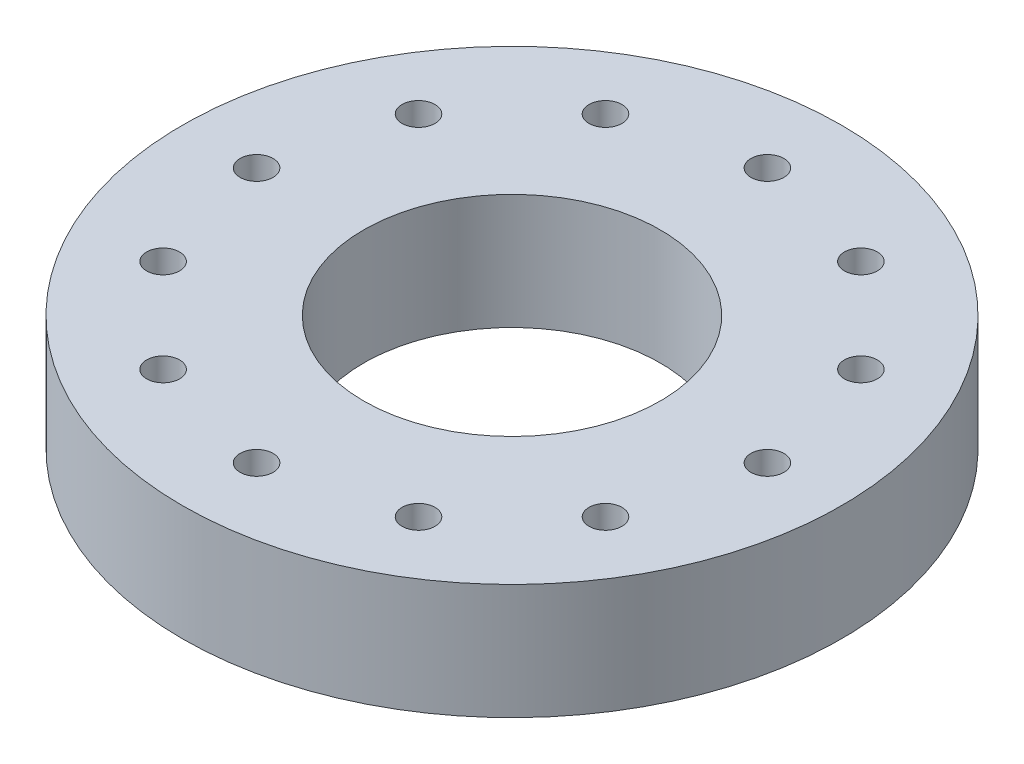
ISO-10303-21;
HEADER;
FILE_DESCRIPTION(('STEP AP214'),'2;1');
FILE_NAME('part.step','',(''),(''),'','','');
FILE_SCHEMA(('AUTOMOTIVE_DESIGN { 1 0 10303 214 1 1 1 1 }'));
ENDSEC;
DATA;
#1=APPLICATION_CONTEXT('core data for automotive mechanical design processes');
#2=APPLICATION_PROTOCOL_DEFINITION('international standard','automotive_design',2000,#1);
#3=PRODUCT_CONTEXT('',#1,'mechanical');
#4=PRODUCT('Part','Part','',(#3));
#5=PRODUCT_RELATED_PRODUCT_CATEGORY('part','',(#4));
#6=PRODUCT_DEFINITION_FORMATION('','',#4);
#7=PRODUCT_DEFINITION_CONTEXT('part definition',#1,'design');
#8=PRODUCT_DEFINITION('design','',#6,#7);
#9=PRODUCT_DEFINITION_SHAPE('','',#8);
#10=(LENGTH_UNIT() NAMED_UNIT(*) SI_UNIT(.MILLI.,.METRE.));
#11=(NAMED_UNIT(*) PLANE_ANGLE_UNIT() SI_UNIT($,.RADIAN.));
#12=(NAMED_UNIT(*) SI_UNIT($,.STERADIAN.) SOLID_ANGLE_UNIT());
#13=UNCERTAINTY_MEASURE_WITH_UNIT(LENGTH_MEASURE(1.E-05),#10,'distance_accuracy_value','');
#14=(GEOMETRIC_REPRESENTATION_CONTEXT(3) GLOBAL_UNCERTAINTY_ASSIGNED_CONTEXT((#13)) GLOBAL_UNIT_ASSIGNED_CONTEXT((#10,
#11,#12)) REPRESENTATION_CONTEXT('',''));
#15=CARTESIAN_POINT('',(0.,0.,0.));
#16=DIRECTION('',(0.,0.,1.));
#17=DIRECTION('',(1.,0.,0.));
#18=AXIS2_PLACEMENT_3D('',#15,#16,#17);
#19=CARTESIAN_POINT('',(0.,7.,0.));
#20=DIRECTION('',(0.,1.,0.));
#21=DIRECTION('',(0.,0.,1.));
#22=AXIS2_PLACEMENT_3D('',#19,#20,#21);
#23=PLANE('',#22);
#24=CARTESIAN_POINT('',(-13.4233937586585,7.,-7.74999999999942));
#25=DIRECTION('',(0.,1.,0.));
#26=DIRECTION('',(0.,0.,1.));
#27=AXIS2_PLACEMENT_3D('',#24,#25,#26);
#28=CIRCLE('',#27,1.00000000000067);
#29=CARTESIAN_POINT('',(-13.4233937586585,7.,-6.74999999999875));
#30=VERTEX_POINT('',#29);
#31=EDGE_CURVE('E107',#30,#30,#28,.T.);
#32=ORIENTED_EDGE('',*,*,#31,.F.);
#33=EDGE_LOOP('',(#32));
#34=FACE_BOUND('',#33,.T.);
#35=CARTESIAN_POINT('',(-13.4233937586578,7.,7.75000000000058));
#36=DIRECTION('',(0.,1.,0.));
#37=DIRECTION('',(0.,0.,1.));
#38=AXIS2_PLACEMENT_3D('',#35,#36,#37);
#39=CIRCLE('',#38,1.00000000000125);
#40=CARTESIAN_POINT('',(-13.4233937586578,7.,8.75000000000183));
#41=VERTEX_POINT('',#40);
#42=EDGE_CURVE('E95',#41,#41,#39,.T.);
#43=ORIENTED_EDGE('',*,*,#42,.F.);
#44=EDGE_LOOP('',(#43));
#45=FACE_BOUND('',#44,.T.);
#46=CARTESIAN_POINT('',(7.75000000000123,7.,13.4233937586585));
#47=DIRECTION('',(0.,1.,0.));
#48=DIRECTION('',(0.,0.,1.));
#49=AXIS2_PLACEMENT_3D('',#46,#47,#48);
#50=CIRCLE('',#49,1.00000000000135);
#51=CARTESIAN_POINT('',(7.75000000000123,7.,14.4233937586598));
#52=VERTEX_POINT('',#51);
#53=EDGE_CURVE('E83',#52,#52,#50,.T.);
#54=ORIENTED_EDGE('',*,*,#53,.F.);
#55=EDGE_LOOP('',(#54));
#56=FACE_BOUND('',#55,.T.);
#57=CARTESIAN_POINT('',(15.5000000000007,7.,-6.57957440448876E-13));
#58=DIRECTION('',(0.,1.,0.));
#59=DIRECTION('',(0.,0.,1.));
#60=AXIS2_PLACEMENT_3D('',#57,#58,#59);
#61=CIRCLE('',#60,1.0000000000008);
#62=CARTESIAN_POINT('',(15.5000000000007,7.,1.00000000000014));
#63=VERTEX_POINT('',#62);
#64=EDGE_CURVE('E71',#63,#63,#61,.T.);
#65=ORIENTED_EDGE('',*,*,#64,.F.);
#66=EDGE_LOOP('',(#65));
#67=FACE_BOUND('',#66,.T.);
#68=CARTESIAN_POINT('',(7.7500000000002,7.,-13.4233937586593));
#69=DIRECTION('',(0.,1.,0.));
#70=DIRECTION('',(0.,0.,1.));
#71=AXIS2_PLACEMENT_3D('',#68,#69,#70);
#72=CIRCLE('',#71,1.00000000000019);
#73=CARTESIAN_POINT('',(7.7500000000002,7.,-12.4233937586592));
#74=VERTEX_POINT('',#73);
#75=EDGE_CURVE('E59',#74,#74,#72,.T.);
#76=ORIENTED_EDGE('',*,*,#75,.F.);
#77=EDGE_LOOP('',(#76));
#78=FACE_BOUND('',#77,.T.);
#79=CARTESIAN_POINT('',(0.,7.,-15.5));
#80=DIRECTION('',(0.,1.,0.));
#81=DIRECTION('',(0.,0.,1.));
#82=AXIS2_PLACEMENT_3D('',#79,#80,#81);
#83=CIRCLE('',#82,1.);
#84=CARTESIAN_POINT('',(0.,7.,-14.5));
#85=VERTEX_POINT('',#84);
#86=EDGE_CURVE('E47',#85,#85,#83,.T.);
#87=ORIENTED_EDGE('',*,*,#86,.F.);
#88=EDGE_LOOP('',(#87));
#89=FACE_BOUND('',#88,.T.);
#90=CARTESIAN_POINT('',(0.,7.,0.));
#91=DIRECTION('',(0.,1.,0.));
#92=DIRECTION('',(0.,0.,1.));
#93=AXIS2_PLACEMENT_3D('',#90,#91,#92);
#94=CIRCLE('',#93,20.);
#95=CARTESIAN_POINT('',(0.,7.,20.));
#96=VERTEX_POINT('',#95);
#97=EDGE_CURVE('E10',#96,#96,#94,.T.);
#98=ORIENTED_EDGE('',*,*,#97,.T.);
#99=EDGE_LOOP('',(#98));
#100=FACE_BOUND('',#99,.T.);
#101=CARTESIAN_POINT('',(0.,7.,0.));
#102=DIRECTION('',(0.,1.,0.));
#103=DIRECTION('',(0.,0.,1.));
#104=AXIS2_PLACEMENT_3D('',#101,#102,#103);
#105=CIRCLE('',#104,9.);
#106=CARTESIAN_POINT('',(0.,7.,9.));
#107=VERTEX_POINT('',#106);
#108=EDGE_CURVE('E42',#107,#107,#105,.T.);
#109=ORIENTED_EDGE('',*,*,#108,.F.);
#110=EDGE_LOOP('',(#109));
#111=FACE_BOUND('',#110,.T.);
#112=CARTESIAN_POINT('',(1.31591488089775E-12,7.,15.5));
#113=DIRECTION('',(0.,1.,0.));
#114=DIRECTION('',(0.,0.,1.));
#115=AXIS2_PLACEMENT_3D('',#112,#113,#114);
#116=CIRCLE('',#115,1.00000000000136);
#117=CARTESIAN_POINT('',(1.31591488089775E-12,7.,16.5000000000014));
#118=VERTEX_POINT('',#117);
#119=EDGE_CURVE('E53',#118,#118,#116,.T.);
#120=ORIENTED_EDGE('',*,*,#119,.F.);
#121=EDGE_LOOP('',(#120));
#122=FACE_BOUND('',#121,.T.);
#123=CARTESIAN_POINT('',(13.4233937586589,7.,-7.75000000000091));
#124=DIRECTION('',(0.,1.,0.));
#125=DIRECTION('',(0.,0.,1.));
#126=AXIS2_PLACEMENT_3D('',#123,#124,#125);
#127=CIRCLE('',#126,1.00000000000085);
#128=CARTESIAN_POINT('',(13.4233937586589,7.,-6.75000000000007));
#129=VERTEX_POINT('',#128);
#130=EDGE_CURVE('E65',#129,#129,#127,.T.);
#131=ORIENTED_EDGE('',*,*,#130,.F.);
#132=EDGE_LOOP('',(#131));
#133=FACE_BOUND('',#132,.T.);
#134=CARTESIAN_POINT('',(13.4233937586598,7.,7.74999999999943));
#135=DIRECTION('',(0.,1.,0.));
#136=DIRECTION('',(0.,0.,1.));
#137=AXIS2_PLACEMENT_3D('',#134,#135,#136);
#138=CIRCLE('',#137,1.000000000001);
#139=CARTESIAN_POINT('',(13.4233937586598,7.,8.75000000000042));
#140=VERTEX_POINT('',#139);
#141=EDGE_CURVE('E77',#140,#140,#138,.T.);
#142=ORIENTED_EDGE('',*,*,#141,.F.);
#143=EDGE_LOOP('',(#142));
#144=FACE_BOUND('',#143,.T.);
#145=CARTESIAN_POINT('',(-7.74999999999877,7.,13.4233937586591));
#146=DIRECTION('',(0.,1.,0.));
#147=DIRECTION('',(0.,0.,1.));
#148=AXIS2_PLACEMENT_3D('',#145,#146,#147);
#149=CIRCLE('',#148,1.00000000000139);
#150=CARTESIAN_POINT('',(-7.74999999999877,7.,14.4233937586605));
#151=VERTEX_POINT('',#150);
#152=EDGE_CURVE('E89',#151,#151,#149,.T.);
#153=ORIENTED_EDGE('',*,*,#152,.F.);
#154=EDGE_LOOP('',(#153));
#155=FACE_BOUND('',#154,.T.);
#156=CARTESIAN_POINT('',(-15.4999999999993,7.,6.59855642987554E-13));
#157=DIRECTION('',(0.,1.,0.));
#158=DIRECTION('',(0.,0.,1.));
#159=AXIS2_PLACEMENT_3D('',#156,#157,#158);
#160=CIRCLE('',#159,1.00000000000098);
#161=CARTESIAN_POINT('',(-15.4999999999993,7.,1.00000000000164));
#162=VERTEX_POINT('',#161);
#163=EDGE_CURVE('E101',#162,#162,#160,.T.);
#164=ORIENTED_EDGE('',*,*,#163,.F.);
#165=EDGE_LOOP('',(#164));
#166=FACE_BOUND('',#165,.T.);
#167=CARTESIAN_POINT('',(-7.74999999999983,7.,-13.4233937586589));
#168=DIRECTION('',(0.,1.,0.));
#169=DIRECTION('',(0.,0.,1.));
#170=AXIS2_PLACEMENT_3D('',#167,#168,#169);
#171=CIRCLE('',#170,1.);
#172=CARTESIAN_POINT('',(-7.74999999999983,7.,-12.4233937586589));
#173=VERTEX_POINT('',#172);
#174=EDGE_CURVE('E113',#173,#173,#171,.T.);
#175=ORIENTED_EDGE('',*,*,#174,.F.);
#176=EDGE_LOOP('',(#175));
#177=FACE_BOUND('',#176,.T.);
#178=ADVANCED_FACE('F31',(#34,#45,#56,#67,#78,#89,#100,#111,#122,#133,#144,#155,#166,#177),#23,.T.);
#179=CARTESIAN_POINT('',(0.,0.,0.));
#180=DIRECTION('',(0.,1.,0.));
#181=DIRECTION('',(0.,0.,1.));
#182=AXIS2_PLACEMENT_3D('',#179,#180,#181);
#183=PLANE('',#182);
#184=CARTESIAN_POINT('',(0.,0.,0.));
#185=DIRECTION('',(0.,1.,0.));
#186=DIRECTION('',(0.,0.,1.));
#187=AXIS2_PLACEMENT_3D('',#184,#185,#186);
#188=CIRCLE('',#187,20.);
#189=CARTESIAN_POINT('',(0.,0.,20.));
#190=VERTEX_POINT('',#189);
#191=EDGE_CURVE('E35',#190,#190,#188,.T.);
#192=ORIENTED_EDGE('',*,*,#191,.F.);
#193=EDGE_LOOP('',(#192));
#194=FACE_BOUND('',#193,.T.);
#195=CARTESIAN_POINT('',(0.,0.,0.));
#196=DIRECTION('',(0.,1.,0.));
#197=DIRECTION('',(0.,0.,1.));
#198=AXIS2_PLACEMENT_3D('',#195,#196,#197);
#199=CIRCLE('',#198,9.);
#200=CARTESIAN_POINT('',(0.,0.,9.));
#201=VERTEX_POINT('',#200);
#202=EDGE_CURVE('E44',#201,#201,#199,.T.);
#203=ORIENTED_EDGE('',*,*,#202,.T.);
#204=EDGE_LOOP('',(#203));
#205=FACE_BOUND('',#204,.T.);
#206=CARTESIAN_POINT('',(0.,0.,-15.5));
#207=DIRECTION('',(0.,1.,0.));
#208=DIRECTION('',(0.,0.,1.));
#209=AXIS2_PLACEMENT_3D('',#206,#207,#208);
#210=CIRCLE('',#209,1.);
#211=CARTESIAN_POINT('',(0.,0.,-14.5));
#212=VERTEX_POINT('',#211);
#213=EDGE_CURVE('E50',#212,#212,#210,.T.);
#214=ORIENTED_EDGE('',*,*,#213,.T.);
#215=EDGE_LOOP('',(#214));
#216=FACE_BOUND('',#215,.T.);
#217=CARTESIAN_POINT('',(1.31591488089775E-12,0.,15.5));
#218=DIRECTION('',(0.,1.,0.));
#219=DIRECTION('',(0.,0.,1.));
#220=AXIS2_PLACEMENT_3D('',#217,#218,#219);
#221=CIRCLE('',#220,1.00000000000136);
#222=CARTESIAN_POINT('',(1.31591488089775E-12,0.,16.5000000000014));
#223=VERTEX_POINT('',#222);
#224=EDGE_CURVE('E56',#223,#223,#221,.T.);
#225=ORIENTED_EDGE('',*,*,#224,.T.);
#226=EDGE_LOOP('',(#225));
#227=FACE_BOUND('',#226,.T.);
#228=CARTESIAN_POINT('',(7.7500000000002,0.,-13.4233937586593));
#229=DIRECTION('',(0.,1.,0.));
#230=DIRECTION('',(0.,0.,1.));
#231=AXIS2_PLACEMENT_3D('',#228,#229,#230);
#232=CIRCLE('',#231,1.00000000000019);
#233=CARTESIAN_POINT('',(7.7500000000002,0.,-12.4233937586592));
#234=VERTEX_POINT('',#233);
#235=EDGE_CURVE('E62',#234,#234,#232,.T.);
#236=ORIENTED_EDGE('',*,*,#235,.T.);
#237=EDGE_LOOP('',(#236));
#238=FACE_BOUND('',#237,.T.);
#239=CARTESIAN_POINT('',(13.4233937586589,0.,-7.75000000000091));
#240=DIRECTION('',(0.,1.,0.));
#241=DIRECTION('',(0.,0.,1.));
#242=AXIS2_PLACEMENT_3D('',#239,#240,#241);
#243=CIRCLE('',#242,1.00000000000085);
#244=CARTESIAN_POINT('',(13.4233937586589,0.,-6.75000000000007));
#245=VERTEX_POINT('',#244);
#246=EDGE_CURVE('E68',#245,#245,#243,.T.);
#247=ORIENTED_EDGE('',*,*,#246,.T.);
#248=EDGE_LOOP('',(#247));
#249=FACE_BOUND('',#248,.T.);
#250=CARTESIAN_POINT('',(15.5000000000007,0.,-6.57957440448876E-13));
#251=DIRECTION('',(0.,1.,0.));
#252=DIRECTION('',(0.,0.,1.));
#253=AXIS2_PLACEMENT_3D('',#250,#251,#252);
#254=CIRCLE('',#253,1.0000000000008);
#255=CARTESIAN_POINT('',(15.5000000000007,0.,1.00000000000014));
#256=VERTEX_POINT('',#255);
#257=EDGE_CURVE('E74',#256,#256,#254,.T.);
#258=ORIENTED_EDGE('',*,*,#257,.T.);
#259=EDGE_LOOP('',(#258));
#260=FACE_BOUND('',#259,.T.);
#261=CARTESIAN_POINT('',(13.4233937586598,0.,7.74999999999943));
#262=DIRECTION('',(0.,1.,0.));
#263=DIRECTION('',(0.,0.,1.));
#264=AXIS2_PLACEMENT_3D('',#261,#262,#263);
#265=CIRCLE('',#264,1.000000000001);
#266=CARTESIAN_POINT('',(13.4233937586598,0.,8.75000000000042));
#267=VERTEX_POINT('',#266);
#268=EDGE_CURVE('E80',#267,#267,#265,.T.);
#269=ORIENTED_EDGE('',*,*,#268,.T.);
#270=EDGE_LOOP('',(#269));
#271=FACE_BOUND('',#270,.T.);
#272=CARTESIAN_POINT('',(7.75000000000123,0.,13.4233937586585));
#273=DIRECTION('',(0.,1.,0.));
#274=DIRECTION('',(0.,0.,1.));
#275=AXIS2_PLACEMENT_3D('',#272,#273,#274);
#276=CIRCLE('',#275,1.00000000000135);
#277=CARTESIAN_POINT('',(7.75000000000123,0.,14.4233937586598));
#278=VERTEX_POINT('',#277);
#279=EDGE_CURVE('E86',#278,#278,#276,.T.);
#280=ORIENTED_EDGE('',*,*,#279,.T.);
#281=EDGE_LOOP('',(#280));
#282=FACE_BOUND('',#281,.T.);
#283=CARTESIAN_POINT('',(-7.74999999999877,0.,13.4233937586591));
#284=DIRECTION('',(0.,1.,0.));
#285=DIRECTION('',(0.,0.,1.));
#286=AXIS2_PLACEMENT_3D('',#283,#284,#285);
#287=CIRCLE('',#286,1.00000000000139);
#288=CARTESIAN_POINT('',(-7.74999999999877,0.,14.4233937586605));
#289=VERTEX_POINT('',#288);
#290=EDGE_CURVE('E92',#289,#289,#287,.T.);
#291=ORIENTED_EDGE('',*,*,#290,.T.);
#292=EDGE_LOOP('',(#291));
#293=FACE_BOUND('',#292,.T.);
#294=CARTESIAN_POINT('',(-13.4233937586578,0.,7.75000000000058));
#295=DIRECTION('',(0.,1.,0.));
#296=DIRECTION('',(0.,0.,1.));
#297=AXIS2_PLACEMENT_3D('',#294,#295,#296);
#298=CIRCLE('',#297,1.00000000000125);
#299=CARTESIAN_POINT('',(-13.4233937586578,0.,8.75000000000183));
#300=VERTEX_POINT('',#299);
#301=EDGE_CURVE('E98',#300,#300,#298,.T.);
#302=ORIENTED_EDGE('',*,*,#301,.T.);
#303=EDGE_LOOP('',(#302));
#304=FACE_BOUND('',#303,.T.);
#305=CARTESIAN_POINT('',(-15.4999999999993,0.,6.59855642987554E-13));
#306=DIRECTION('',(0.,1.,0.));
#307=DIRECTION('',(0.,0.,1.));
#308=AXIS2_PLACEMENT_3D('',#305,#306,#307);
#309=CIRCLE('',#308,1.00000000000098);
#310=CARTESIAN_POINT('',(-15.4999999999993,0.,1.00000000000164));
#311=VERTEX_POINT('',#310);
#312=EDGE_CURVE('E104',#311,#311,#309,.T.);
#313=ORIENTED_EDGE('',*,*,#312,.T.);
#314=EDGE_LOOP('',(#313));
#315=FACE_BOUND('',#314,.T.);
#316=CARTESIAN_POINT('',(-13.4233937586585,0.,-7.74999999999942));
#317=DIRECTION('',(0.,1.,0.));
#318=DIRECTION('',(0.,0.,1.));
#319=AXIS2_PLACEMENT_3D('',#316,#317,#318);
#320=CIRCLE('',#319,1.00000000000067);
#321=CARTESIAN_POINT('',(-13.4233937586585,0.,-6.74999999999875));
#322=VERTEX_POINT('',#321);
#323=EDGE_CURVE('E110',#322,#322,#320,.T.);
#324=ORIENTED_EDGE('',*,*,#323,.T.);
#325=EDGE_LOOP('',(#324));
#326=FACE_BOUND('',#325,.T.);
#327=CARTESIAN_POINT('',(-7.74999999999983,0.,-13.4233937586589));
#328=DIRECTION('',(0.,1.,0.));
#329=DIRECTION('',(0.,0.,1.));
#330=AXIS2_PLACEMENT_3D('',#327,#328,#329);
#331=CIRCLE('',#330,1.);
#332=CARTESIAN_POINT('',(-7.74999999999983,0.,-12.4233937586589));
#333=VERTEX_POINT('',#332);
#334=EDGE_CURVE('E116',#333,#333,#331,.T.);
#335=ORIENTED_EDGE('',*,*,#334,.T.);
#336=EDGE_LOOP('',(#335));
#337=FACE_BOUND('',#336,.T.);
#338=ADVANCED_FACE('F126',(#194,#205,#216,#227,#238,#249,#260,#271,#282,#293,#304,#315,#326,
#337),#183,.F.);
#339=CARTESIAN_POINT('',(0.,7.,0.));
#340=DIRECTION('',(0.,-1.,0.));
#341=DIRECTION('',(0.,0.,-1.));
#342=AXIS2_PLACEMENT_3D('',#339,#340,#341);
#343=CYLINDRICAL_SURFACE('',#342,20.);
#344=ORIENTED_EDGE('',*,*,#97,.F.);
#345=EDGE_LOOP('',(#344));
#346=FACE_BOUND('',#345,.T.);
#347=ORIENTED_EDGE('',*,*,#191,.T.);
#348=EDGE_LOOP('',(#347));
#349=FACE_BOUND('',#348,.T.);
#350=ADVANCED_FACE('F33',(#346,#349),#343,.T.);
#351=CARTESIAN_POINT('',(0.,7.,0.));
#352=DIRECTION('',(0.,-1.,0.));
#353=DIRECTION('',(0.,0.,-1.));
#354=AXIS2_PLACEMENT_3D('',#351,#352,#353);
#355=CYLINDRICAL_SURFACE('',#354,9.);
#356=ORIENTED_EDGE('',*,*,#108,.T.);
#357=EDGE_LOOP('',(#356));
#358=FACE_BOUND('',#357,.T.);
#359=ORIENTED_EDGE('',*,*,#202,.F.);
#360=EDGE_LOOP('',(#359));
#361=FACE_BOUND('',#360,.T.);
#362=ADVANCED_FACE('F136',(#358,#361),#355,.F.);
#363=CARTESIAN_POINT('',(0.,7.,-15.5));
#364=DIRECTION('',(0.,-1.,0.));
#365=DIRECTION('',(0.,0.,-1.));
#366=AXIS2_PLACEMENT_3D('',#363,#364,#365);
#367=CYLINDRICAL_SURFACE('',#366,1.);
#368=ORIENTED_EDGE('',*,*,#86,.T.);
#369=EDGE_LOOP('',(#368));
#370=FACE_BOUND('',#369,.T.);
#371=ORIENTED_EDGE('',*,*,#213,.F.);
#372=EDGE_LOOP('',(#371));
#373=FACE_BOUND('',#372,.T.);
#374=ADVANCED_FACE('F139',(#370,#373),#367,.F.);
#375=CARTESIAN_POINT('',(1.31591488089775E-12,7.,15.5));
#376=DIRECTION('',(0.,-1.,0.));
#377=DIRECTION('',(0.,0.,-1.));
#378=AXIS2_PLACEMENT_3D('',#375,#376,#377);
#379=CYLINDRICAL_SURFACE('',#378,1.00000000000136);
#380=ORIENTED_EDGE('',*,*,#119,.T.);
#381=EDGE_LOOP('',(#380));
#382=FACE_BOUND('',#381,.T.);
#383=ORIENTED_EDGE('',*,*,#224,.F.);
#384=EDGE_LOOP('',(#383));
#385=FACE_BOUND('',#384,.T.);
#386=ADVANCED_FACE('F143',(#382,#385),#379,.F.);
#387=CARTESIAN_POINT('',(7.7500000000002,7.,-13.4233937586593));
#388=DIRECTION('',(0.,-1.,0.));
#389=DIRECTION('',(0.,0.,-1.));
#390=AXIS2_PLACEMENT_3D('',#387,#388,#389);
#391=CYLINDRICAL_SURFACE('',#390,1.00000000000019);
#392=ORIENTED_EDGE('',*,*,#75,.T.);
#393=EDGE_LOOP('',(#392));
#394=FACE_BOUND('',#393,.T.);
#395=ORIENTED_EDGE('',*,*,#235,.F.);
#396=EDGE_LOOP('',(#395));
#397=FACE_BOUND('',#396,.T.);
#398=ADVANCED_FACE('F147',(#394,#397),#391,.F.);
#399=CARTESIAN_POINT('',(13.4233937586589,7.,-7.75000000000091));
#400=DIRECTION('',(0.,-1.,0.));
#401=DIRECTION('',(0.,0.,-1.));
#402=AXIS2_PLACEMENT_3D('',#399,#400,#401);
#403=CYLINDRICAL_SURFACE('',#402,1.00000000000085);
#404=ORIENTED_EDGE('',*,*,#130,.T.);
#405=EDGE_LOOP('',(#404));
#406=FACE_BOUND('',#405,.T.);
#407=ORIENTED_EDGE('',*,*,#246,.F.);
#408=EDGE_LOOP('',(#407));
#409=FACE_BOUND('',#408,.T.);
#410=ADVANCED_FACE('F151',(#406,#409),#403,.F.);
#411=CARTESIAN_POINT('',(15.5000000000007,7.,-6.57957440448876E-13));
#412=DIRECTION('',(0.,-1.,0.));
#413=DIRECTION('',(0.,0.,-1.));
#414=AXIS2_PLACEMENT_3D('',#411,#412,#413);
#415=CYLINDRICAL_SURFACE('',#414,1.0000000000008);
#416=ORIENTED_EDGE('',*,*,#64,.T.);
#417=EDGE_LOOP('',(#416));
#418=FACE_BOUND('',#417,.T.);
#419=ORIENTED_EDGE('',*,*,#257,.F.);
#420=EDGE_LOOP('',(#419));
#421=FACE_BOUND('',#420,.T.);
#422=ADVANCED_FACE('F155',(#418,#421),#415,.F.);
#423=CARTESIAN_POINT('',(13.4233937586598,7.,7.74999999999943));
#424=DIRECTION('',(0.,-1.,0.));
#425=DIRECTION('',(0.,0.,-1.));
#426=AXIS2_PLACEMENT_3D('',#423,#424,#425);
#427=CYLINDRICAL_SURFACE('',#426,1.000000000001);
#428=ORIENTED_EDGE('',*,*,#141,.T.);
#429=EDGE_LOOP('',(#428));
#430=FACE_BOUND('',#429,.T.);
#431=ORIENTED_EDGE('',*,*,#268,.F.);
#432=EDGE_LOOP('',(#431));
#433=FACE_BOUND('',#432,.T.);
#434=ADVANCED_FACE('F159',(#430,#433),#427,.F.);
#435=CARTESIAN_POINT('',(7.75000000000123,7.,13.4233937586585));
#436=DIRECTION('',(0.,-1.,0.));
#437=DIRECTION('',(0.,0.,-1.));
#438=AXIS2_PLACEMENT_3D('',#435,#436,#437);
#439=CYLINDRICAL_SURFACE('',#438,1.00000000000135);
#440=ORIENTED_EDGE('',*,*,#53,.T.);
#441=EDGE_LOOP('',(#440));
#442=FACE_BOUND('',#441,.T.);
#443=ORIENTED_EDGE('',*,*,#279,.F.);
#444=EDGE_LOOP('',(#443));
#445=FACE_BOUND('',#444,.T.);
#446=ADVANCED_FACE('F163',(#442,#445),#439,.F.);
#447=CARTESIAN_POINT('',(-7.74999999999877,7.,13.4233937586591));
#448=DIRECTION('',(0.,-1.,0.));
#449=DIRECTION('',(0.,0.,-1.));
#450=AXIS2_PLACEMENT_3D('',#447,#448,#449);
#451=CYLINDRICAL_SURFACE('',#450,1.00000000000139);
#452=ORIENTED_EDGE('',*,*,#152,.T.);
#453=EDGE_LOOP('',(#452));
#454=FACE_BOUND('',#453,.T.);
#455=ORIENTED_EDGE('',*,*,#290,.F.);
#456=EDGE_LOOP('',(#455));
#457=FACE_BOUND('',#456,.T.);
#458=ADVANCED_FACE('F167',(#454,#457),#451,.F.);
#459=CARTESIAN_POINT('',(-13.4233937586578,7.,7.75000000000058));
#460=DIRECTION('',(0.,-1.,0.));
#461=DIRECTION('',(0.,0.,-1.));
#462=AXIS2_PLACEMENT_3D('',#459,#460,#461);
#463=CYLINDRICAL_SURFACE('',#462,1.00000000000125);
#464=ORIENTED_EDGE('',*,*,#42,.T.);
#465=EDGE_LOOP('',(#464));
#466=FACE_BOUND('',#465,.T.);
#467=ORIENTED_EDGE('',*,*,#301,.F.);
#468=EDGE_LOOP('',(#467));
#469=FACE_BOUND('',#468,.T.);
#470=ADVANCED_FACE('F171',(#466,#469),#463,.F.);
#471=CARTESIAN_POINT('',(-15.4999999999993,7.,6.59855642987554E-13));
#472=DIRECTION('',(0.,-1.,0.));
#473=DIRECTION('',(0.,0.,-1.));
#474=AXIS2_PLACEMENT_3D('',#471,#472,#473);
#475=CYLINDRICAL_SURFACE('',#474,1.00000000000098);
#476=ORIENTED_EDGE('',*,*,#163,.T.);
#477=EDGE_LOOP('',(#476));
#478=FACE_BOUND('',#477,.T.);
#479=ORIENTED_EDGE('',*,*,#312,.F.);
#480=EDGE_LOOP('',(#479));
#481=FACE_BOUND('',#480,.T.);
#482=ADVANCED_FACE('F175',(#478,#481),#475,.F.);
#483=CARTESIAN_POINT('',(-13.4233937586585,7.,-7.74999999999942));
#484=DIRECTION('',(0.,-1.,0.));
#485=DIRECTION('',(0.,0.,-1.));
#486=AXIS2_PLACEMENT_3D('',#483,#484,#485);
#487=CYLINDRICAL_SURFACE('',#486,1.00000000000067);
#488=ORIENTED_EDGE('',*,*,#31,.T.);
#489=EDGE_LOOP('',(#488));
#490=FACE_BOUND('',#489,.T.);
#491=ORIENTED_EDGE('',*,*,#323,.F.);
#492=EDGE_LOOP('',(#491));
#493=FACE_BOUND('',#492,.T.);
#494=ADVANCED_FACE('F179',(#490,#493),#487,.F.);
#495=CARTESIAN_POINT('',(-7.74999999999983,7.,-13.4233937586589));
#496=DIRECTION('',(0.,-1.,0.));
#497=DIRECTION('',(0.,0.,-1.));
#498=AXIS2_PLACEMENT_3D('',#495,#496,#497);
#499=CYLINDRICAL_SURFACE('',#498,1.);
#500=ORIENTED_EDGE('',*,*,#174,.T.);
#501=EDGE_LOOP('',(#500));
#502=FACE_BOUND('',#501,.T.);
#503=ORIENTED_EDGE('',*,*,#334,.F.);
#504=EDGE_LOOP('',(#503));
#505=FACE_BOUND('',#504,.T.);
#506=ADVANCED_FACE('F122',(#502,#505),#499,.F.);
#507=CLOSED_SHELL('',(#178,#338,#350,#362,#374,#386,#398,#410,#422,#434,#446,#458,#470,#482,
#494,#506));
#508=MANIFOLD_SOLID_BREP('B2',#507);
#509=ADVANCED_BREP_SHAPE_REPRESENTATION('',(#18,#508),#14);
#510=SHAPE_DEFINITION_REPRESENTATION(#9,#509);
ENDSEC;
END-ISO-10303-21;
